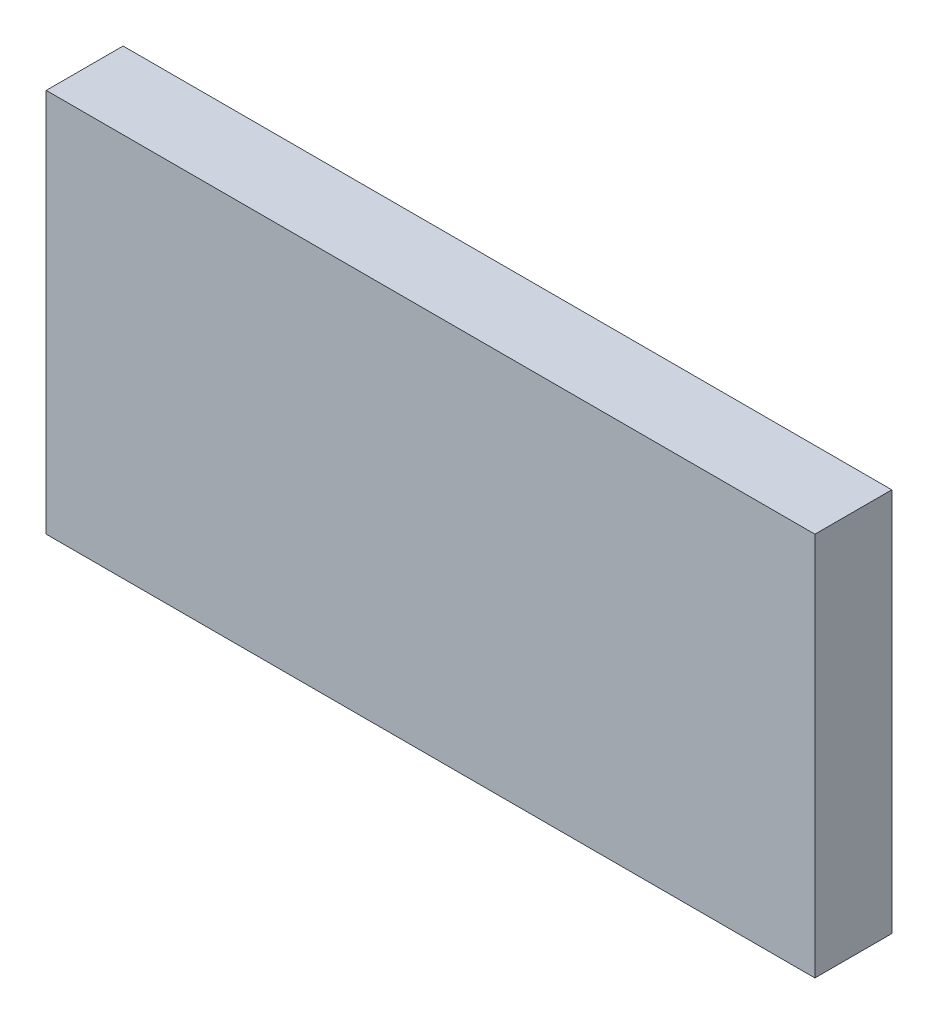
ISO-10303-21;
HEADER;
FILE_DESCRIPTION(('STEP AP214'),'2;1');
FILE_NAME('part.step','',(''),(''),'','','');
FILE_SCHEMA(('AUTOMOTIVE_DESIGN { 1 0 10303 214 1 1 1 1 }'));
ENDSEC;
DATA;
#1=APPLICATION_CONTEXT('core data for automotive mechanical design processes');
#2=APPLICATION_PROTOCOL_DEFINITION('international standard','automotive_design',2000,#1);
#3=PRODUCT_CONTEXT('',#1,'mechanical');
#4=PRODUCT('Part','Part','',(#3));
#5=PRODUCT_RELATED_PRODUCT_CATEGORY('part','',(#4));
#6=PRODUCT_DEFINITION_FORMATION('','',#4);
#7=PRODUCT_DEFINITION_CONTEXT('part definition',#1,'design');
#8=PRODUCT_DEFINITION('design','',#6,#7);
#9=PRODUCT_DEFINITION_SHAPE('','',#8);
#10=(LENGTH_UNIT() NAMED_UNIT(*) SI_UNIT(.MILLI.,.METRE.));
#11=(NAMED_UNIT(*) PLANE_ANGLE_UNIT() SI_UNIT($,.RADIAN.));
#12=(NAMED_UNIT(*) SI_UNIT($,.STERADIAN.) SOLID_ANGLE_UNIT());
#13=UNCERTAINTY_MEASURE_WITH_UNIT(LENGTH_MEASURE(1.E-05),#10,'distance_accuracy_value','');
#14=(GEOMETRIC_REPRESENTATION_CONTEXT(3) GLOBAL_UNCERTAINTY_ASSIGNED_CONTEXT((#13)) GLOBAL_UNIT_ASSIGNED_CONTEXT((#10,
#11,#12)) REPRESENTATION_CONTEXT('',''));
#15=CARTESIAN_POINT('',(0.,0.,0.));
#16=DIRECTION('',(0.,0.,1.));
#17=DIRECTION('',(1.,0.,0.));
#18=AXIS2_PLACEMENT_3D('',#15,#16,#17);
#19=CARTESIAN_POINT('',(-0.6,-0.55,0.5));
#20=DIRECTION('',(1.,0.,0.));
#21=DIRECTION('',(0.,1.,0.));
#22=AXIS2_PLACEMENT_3D('',#19,#20,#21);
#23=PLANE('',#22);
#24=DIRECTION('',(0.,-1.,0.));
#25=VECTOR('',#24,1.);
#26=CARTESIAN_POINT('',(-0.60000000001,-0.27500000001,0.45000000001));
#27=LINE('',#26,#25);
#28=CARTESIAN_POINT('',(-0.6,-0.55,0.45));
#29=VERTEX_POINT('',#28);
#30=CARTESIAN_POINT('',(-0.6,-0.8,0.45));
#31=VERTEX_POINT('',#30);
#32=EDGE_CURVE('E103',#29,#31,#27,.T.);
#33=ORIENTED_EDGE('',*,*,#32,.F.);
#34=DIRECTION('',(0.,0.,-1.));
#35=VECTOR('',#34,1.);
#36=CARTESIAN_POINT('',(-0.60000000001,-0.55000000001,0.50000000001));
#37=LINE('',#36,#35);
#38=CARTESIAN_POINT('',(-0.6,-0.55,0.5));
#39=VERTEX_POINT('',#38);
#40=EDGE_CURVE('E94',#39,#29,#37,.T.);
#41=ORIENTED_EDGE('',*,*,#40,.F.);
#42=DIRECTION('',(0.,-1.,0.));
#43=VECTOR('',#42,1.);
#44=CARTESIAN_POINT('',(-0.60000000001,-0.27500000001,0.50000000001));
#45=LINE('',#44,#43);
#46=CARTESIAN_POINT('',(-0.6,-0.8,0.5));
#47=VERTEX_POINT('',#46);
#48=EDGE_CURVE('E106',#39,#47,#45,.T.);
#49=ORIENTED_EDGE('',*,*,#48,.T.);
#50=DIRECTION('',(0.,0.,-1.));
#51=VECTOR('',#50,1.);
#52=CARTESIAN_POINT('',(-0.60000000001,-0.80000000001,0.25000000001));
#53=LINE('',#52,#51);
#54=EDGE_CURVE('E11',#47,#31,#53,.T.);
#55=ORIENTED_EDGE('',*,*,#54,.T.);
#56=EDGE_LOOP('',(#33,#41,#49,#55));
#57=FACE_BOUND('',#56,.T.);
#58=ADVANCED_FACE('F17',(#57),#23,.T.);
#59=CARTESIAN_POINT('',(-1.6,-0.8,0.));
#60=DIRECTION('',(0.,-1.,0.));
#61=DIRECTION('',(0.,0.,-1.));
#62=AXIS2_PLACEMENT_3D('',#59,#60,#61);
#63=PLANE('',#62);
#64=ORIENTED_EDGE('',*,*,#54,.F.);
#65=DIRECTION('',(1.,0.,0.));
#66=VECTOR('',#65,1.);
#67=CARTESIAN_POINT('',(-1.60000000001,-0.80000000001,0.50000000001));
#68=LINE('',#67,#66);
#69=CARTESIAN_POINT('',(-1.1,-0.8,0.5));
#70=VERTEX_POINT('',#69);
#71=EDGE_CURVE('E20',#70,#47,#68,.T.);
#72=ORIENTED_EDGE('',*,*,#71,.F.);
#73=DIRECTION('',(0.,0.,1.));
#74=VECTOR('',#73,1.);
#75=CARTESIAN_POINT('',(-1.10000000001,-0.80000000001,0.25000000001));
#76=LINE('',#75,#74);
#77=CARTESIAN_POINT('',(-1.1,-0.8,0.45));
#78=VERTEX_POINT('',#77);
#79=EDGE_CURVE('E79',#78,#70,#76,.T.);
#80=ORIENTED_EDGE('',*,*,#79,.F.);
#81=DIRECTION('',(-1.,0.,0.));
#82=VECTOR('',#81,1.);
#83=CARTESIAN_POINT('',(-1.22500000001,-0.80000000001,0.45000000001));
#84=LINE('',#83,#82);
#85=EDGE_CURVE('E75',#31,#78,#84,.T.);
#86=ORIENTED_EDGE('',*,*,#85,.F.);
#87=EDGE_LOOP('',(#64,#72,#80,#86));
#88=FACE_BOUND('',#87,.T.);
#89=ADVANCED_FACE('F126',(#88),#63,.T.);
#90=CARTESIAN_POINT('',(0.,0.,0.5));
#91=DIRECTION('',(0.,0.,1.));
#92=DIRECTION('',(1.,0.,0.));
#93=AXIS2_PLACEMENT_3D('',#90,#91,#92);
#94=PLANE('',#93);
#95=ORIENTED_EDGE('',*,*,#48,.F.);
#96=DIRECTION('',(1.,0.,0.));
#97=VECTOR('',#96,1.);
#98=CARTESIAN_POINT('',(-0.55000000001,-0.55000000001,0.50000000001));
#99=LINE('',#98,#97);
#100=CARTESIAN_POINT('',(-1.1,-0.55,0.5));
#101=VERTEX_POINT('',#100);
#102=EDGE_CURVE('E89',#101,#39,#99,.T.);
#103=ORIENTED_EDGE('',*,*,#102,.F.);
#104=DIRECTION('',(0.,1.,0.));
#105=VECTOR('',#104,1.);
#106=CARTESIAN_POINT('',(-1.10000000001,-0.40000000001,0.50000000001));
#107=LINE('',#106,#105);
#108=EDGE_CURVE('E84',#70,#101,#107,.T.);
#109=ORIENTED_EDGE('',*,*,#108,.F.);
#110=ORIENTED_EDGE('',*,*,#71,.T.);
#111=EDGE_LOOP('',(#95,#103,#109,#110));
#112=FACE_BOUND('',#111,.T.);
#113=ADVANCED_FACE('F121',(#112),#94,.T.);
#114=CARTESIAN_POINT('',(-1.1,-0.8,0.5));
#115=DIRECTION('',(-1.,0.,0.));
#116=DIRECTION('',(0.,0.,1.));
#117=AXIS2_PLACEMENT_3D('',#114,#115,#116);
#118=PLANE('',#117);
#119=DIRECTION('',(0.,0.,1.));
#120=VECTOR('',#119,1.);
#121=CARTESIAN_POINT('',(-1.10000000001,-0.55000000001,0.50000000001));
#122=LINE('',#121,#120);
#123=CARTESIAN_POINT('',(-1.1,-0.55,0.45));
#124=VERTEX_POINT('',#123);
#125=EDGE_CURVE('E82',#124,#101,#122,.T.);
#126=ORIENTED_EDGE('',*,*,#125,.F.);
#127=DIRECTION('',(0.,1.,0.));
#128=VECTOR('',#127,1.);
#129=CARTESIAN_POINT('',(-1.10000000001,-0.80000000001,0.45000000001));
#130=LINE('',#129,#128);
#131=EDGE_CURVE('E69',#78,#124,#130,.T.);
#132=ORIENTED_EDGE('',*,*,#131,.F.);
#133=ORIENTED_EDGE('',*,*,#79,.T.);
#134=ORIENTED_EDGE('',*,*,#108,.T.);
#135=EDGE_LOOP('',(#126,#132,#133,#134));
#136=FACE_BOUND('',#135,.T.);
#137=ADVANCED_FACE('F83',(#136),#118,.T.);
#138=CARTESIAN_POINT('',(-0.85,0.,0.45));
#139=DIRECTION('',(0.,0.,1.));
#140=DIRECTION('',(1.,0.,0.));
#141=AXIS2_PLACEMENT_3D('',#138,#139,#140);
#142=PLANE('',#141);
#143=ORIENTED_EDGE('',*,*,#32,.T.);
#144=ORIENTED_EDGE('',*,*,#85,.T.);
#145=ORIENTED_EDGE('',*,*,#131,.T.);
#146=DIRECTION('',(1.,0.,0.));
#147=VECTOR('',#146,1.);
#148=CARTESIAN_POINT('',(-0.97500000001,-0.55000000001,0.45000000001));
#149=LINE('',#148,#147);
#150=EDGE_CURVE('E74',#124,#29,#149,.T.);
#151=ORIENTED_EDGE('',*,*,#150,.T.);
#152=EDGE_LOOP('',(#143,#144,#145,#151));
#153=FACE_BOUND('',#152,.T.);
#154=ADVANCED_FACE('F72',(#153),#142,.F.);
#155=CARTESIAN_POINT('',(-1.1,-0.55,0.5));
#156=DIRECTION('',(0.,1.,0.));
#157=DIRECTION('',(1.,0.,0.));
#158=AXIS2_PLACEMENT_3D('',#155,#156,#157);
#159=PLANE('',#158);
#160=ORIENTED_EDGE('',*,*,#150,.F.);
#161=ORIENTED_EDGE('',*,*,#125,.T.);
#162=ORIENTED_EDGE('',*,*,#102,.T.);
#163=ORIENTED_EDGE('',*,*,#40,.T.);
#164=EDGE_LOOP('',(#160,#161,#162,#163));
#165=FACE_BOUND('',#164,.T.);
#166=ADVANCED_FACE('F92',(#165),#159,.T.);
#167=CLOSED_SHELL('',(#58,#89,#113,#137,#154,#166));
#168=MANIFOLD_SOLID_BREP('B1',#167);
#169=ADVANCED_BREP_SHAPE_REPRESENTATION('',(#18,#168),#14);
#170=SHAPE_DEFINITION_REPRESENTATION(#9,#169);
ENDSEC;
END-ISO-10303-21;
